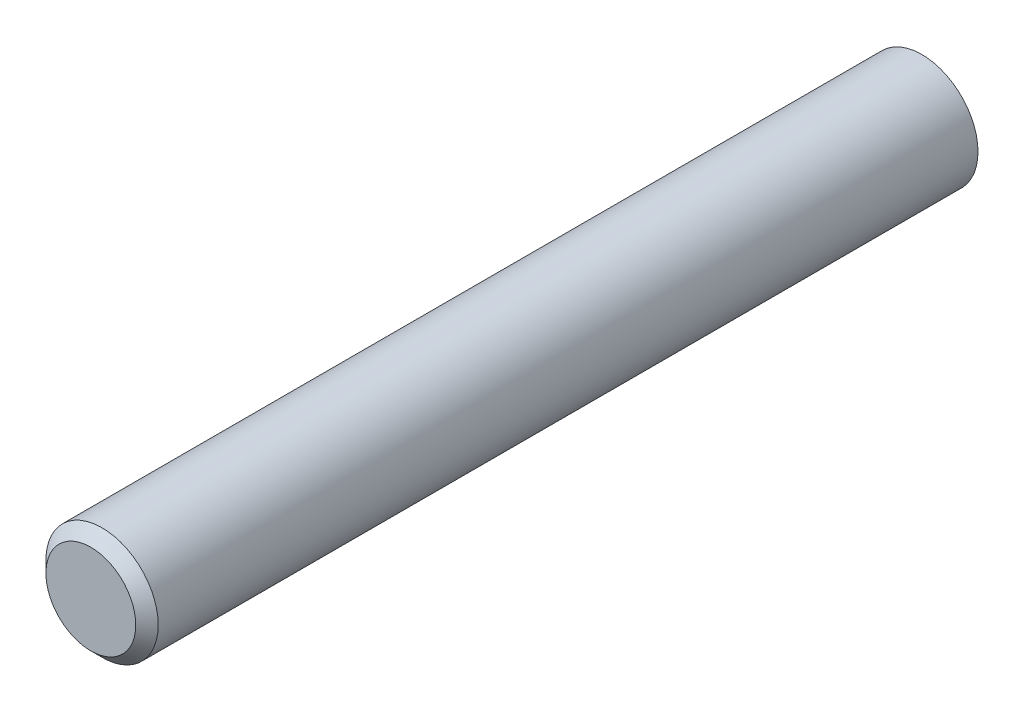
ISO-10303-21;
HEADER;
FILE_DESCRIPTION(('STEP AP214'),'2;1');
FILE_NAME('part.step','',(''),(''),'','','');
FILE_SCHEMA(('AUTOMOTIVE_DESIGN { 1 0 10303 214 1 1 1 1 }'));
ENDSEC;
DATA;
#1=APPLICATION_CONTEXT('core data for automotive mechanical design processes');
#2=APPLICATION_PROTOCOL_DEFINITION('international standard','automotive_design',2000,#1);
#3=PRODUCT_CONTEXT('',#1,'mechanical');
#4=PRODUCT('Part','Part','',(#3));
#5=PRODUCT_RELATED_PRODUCT_CATEGORY('part','',(#4));
#6=PRODUCT_DEFINITION_FORMATION('','',#4);
#7=PRODUCT_DEFINITION_CONTEXT('part definition',#1,'design');
#8=PRODUCT_DEFINITION('design','',#6,#7);
#9=PRODUCT_DEFINITION_SHAPE('','',#8);
#10=(LENGTH_UNIT() NAMED_UNIT(*) SI_UNIT(.MILLI.,.METRE.));
#11=(NAMED_UNIT(*) PLANE_ANGLE_UNIT() SI_UNIT($,.RADIAN.));
#12=(NAMED_UNIT(*) SI_UNIT($,.STERADIAN.) SOLID_ANGLE_UNIT());
#13=UNCERTAINTY_MEASURE_WITH_UNIT(LENGTH_MEASURE(1.E-05),#10,'distance_accuracy_value','');
#14=(GEOMETRIC_REPRESENTATION_CONTEXT(3) GLOBAL_UNCERTAINTY_ASSIGNED_CONTEXT((#13)) GLOBAL_UNIT_ASSIGNED_CONTEXT((#10,
#11,#12)) REPRESENTATION_CONTEXT('',''));
#15=CARTESIAN_POINT('',(0.,0.,0.));
#16=DIRECTION('',(0.,0.,1.));
#17=DIRECTION('',(1.,0.,0.));
#18=AXIS2_PLACEMENT_3D('',#15,#16,#17);
#19=CARTESIAN_POINT('',(0.,0.,100.));
#20=DIRECTION('',(0.,0.,1.));
#21=DIRECTION('',(1.,0.,0.));
#22=AXIS2_PLACEMENT_3D('',#19,#20,#21);
#23=PLANE('',#22);
#24=CARTESIAN_POINT('',(0.,0.,100.));
#25=DIRECTION('',(0.,0.,1.));
#26=DIRECTION('',(1.,0.,0.));
#27=AXIS2_PLACEMENT_3D('',#24,#25,#26);
#28=CIRCLE('',#27,6.4);
#29=CARTESIAN_POINT('',(6.4,0.,100.));
#30=VERTEX_POINT('',#29);
#31=EDGE_CURVE('E26',#30,#30,#28,.T.);
#32=ORIENTED_EDGE('',*,*,#31,.T.);
#33=EDGE_LOOP('',(#32));
#34=FACE_BOUND('',#33,.T.);
#35=ADVANCED_FACE('F16',(#34),#23,.T.);
#36=CARTESIAN_POINT('',(0.,0.,100.));
#37=DIRECTION('',(0.,0.,-1.));
#38=DIRECTION('',(-1.,0.,0.));
#39=AXIS2_PLACEMENT_3D('',#36,#37,#38);
#40=CYLINDRICAL_SURFACE('',#39,8.);
#41=CARTESIAN_POINT('',(0.,-1.24344978758018E-12,-18.4));
#42=DIRECTION('',(0.,0.,-1.));
#43=DIRECTION('',(-1.,0.,0.));
#44=AXIS2_PLACEMENT_3D('',#41,#42,#43);
#45=CIRCLE('',#44,8.);
#46=CARTESIAN_POINT('',(8.,-1.24344978758018E-12,-18.4));
#47=VERTEX_POINT('',#46);
#48=EDGE_CURVE('E49',#47,#47,#45,.T.);
#49=ORIENTED_EDGE('',*,*,#48,.F.);
#50=DIRECTION('',(0.,0.,1.));
#51=VECTOR('',#50,1.);
#52=CARTESIAN_POINT('',(8.,0.,100.));
#53=LINE('',#52,#51);
#54=CARTESIAN_POINT('',(8.,0.,98.4));
#55=VERTEX_POINT('',#54);
#56=EDGE_CURVE('E11',#47,#55,#53,.T.);
#57=ORIENTED_EDGE('',*,*,#56,.T.);
#58=CARTESIAN_POINT('',(0.,0.,98.4));
#59=DIRECTION('',(0.,0.,-1.));
#60=DIRECTION('',(1.,0.,0.));
#61=AXIS2_PLACEMENT_3D('',#58,#59,#60);
#62=CIRCLE('',#61,8.);
#63=EDGE_CURVE('E51',#55,#55,#62,.T.);
#64=ORIENTED_EDGE('',*,*,#63,.T.);
#65=ORIENTED_EDGE('',*,*,#56,.F.);
#66=EDGE_LOOP('',(#49,#57,#64,#65));
#67=FACE_BOUND('',#66,.T.);
#68=ADVANCED_FACE('F18',(#67),#40,.T.);
#69=CARTESIAN_POINT('',(0.,0.,100.));
#70=DIRECTION('',(0.,0.,-1.));
#71=DIRECTION('',(-1.,0.,0.));
#72=AXIS2_PLACEMENT_3D('',#69,#70,#71);
#73=CONICAL_SURFACE('',#72,6.4,0.78539816339745);
#74=ORIENTED_EDGE('',*,*,#63,.F.);
#75=DIRECTION('',(-0.707106781186549,0.,0.707106781186546));
#76=VECTOR('',#75,1.);
#77=CARTESIAN_POINT('',(6.4,0.,100.));
#78=LINE('',#77,#76);
#79=EDGE_CURVE('E20',#55,#30,#78,.T.);
#80=ORIENTED_EDGE('',*,*,#79,.T.);
#81=ORIENTED_EDGE('',*,*,#31,.F.);
#82=ORIENTED_EDGE('',*,*,#79,.F.);
#83=EDGE_LOOP('',(#74,#80,#81,#82));
#84=FACE_BOUND('',#83,.T.);
#85=ADVANCED_FACE('F66',(#84),#73,.T.);
#86=CARTESIAN_POINT('',(0.,-1.24344978758018E-12,-18.4));
#87=DIRECTION('',(0.,0.,1.));
#88=DIRECTION('',(0.,-1.,0.));
#89=AXIS2_PLACEMENT_3D('',#86,#87,#88);
#90=PLANE('',#89);
#91=ORIENTED_EDGE('',*,*,#48,.T.);
#92=EDGE_LOOP('',(#91));
#93=FACE_BOUND('',#92,.T.);
#94=ADVANCED_FACE('F53',(#93),#90,.F.);
#95=CLOSED_SHELL('',(#35,#68,#85,#94));
#96=MANIFOLD_SOLID_BREP('B1',#95);
#97=ADVANCED_BREP_SHAPE_REPRESENTATION('',(#18,#96),#14);
#98=SHAPE_DEFINITION_REPRESENTATION(#9,#97);
ENDSEC;
END-ISO-10303-21;
